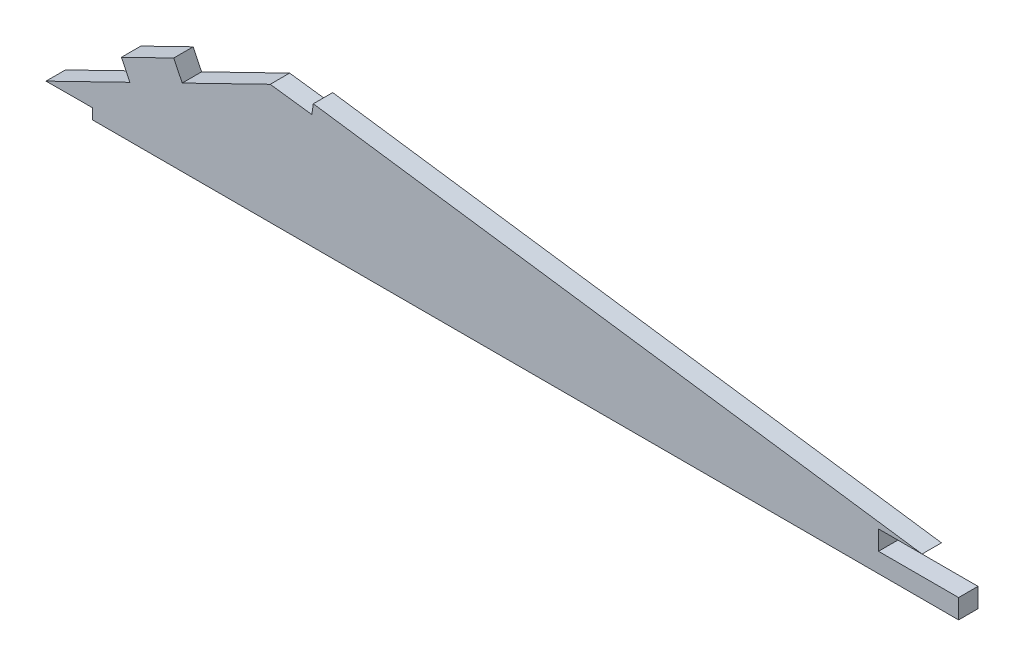
ISO-10303-21;
HEADER;
FILE_DESCRIPTION(('STEP AP214'),'2;1');
FILE_NAME('part.step','',(''),(''),'','','');
FILE_SCHEMA(('AUTOMOTIVE_DESIGN { 1 0 10303 214 1 1 1 1 }'));
ENDSEC;
DATA;
#1=APPLICATION_CONTEXT('core data for automotive mechanical design processes');
#2=APPLICATION_PROTOCOL_DEFINITION('international standard','automotive_design',2000,#1);
#3=PRODUCT_CONTEXT('',#1,'mechanical');
#4=PRODUCT('Part','Part','',(#3));
#5=PRODUCT_RELATED_PRODUCT_CATEGORY('part','',(#4));
#6=PRODUCT_DEFINITION_FORMATION('','',#4);
#7=PRODUCT_DEFINITION_CONTEXT('part definition',#1,'design');
#8=PRODUCT_DEFINITION('design','',#6,#7);
#9=PRODUCT_DEFINITION_SHAPE('','',#8);
#10=(LENGTH_UNIT() NAMED_UNIT(*) SI_UNIT(.MILLI.,.METRE.));
#11=(NAMED_UNIT(*) PLANE_ANGLE_UNIT() SI_UNIT($,.RADIAN.));
#12=(NAMED_UNIT(*) SI_UNIT($,.STERADIAN.) SOLID_ANGLE_UNIT());
#13=UNCERTAINTY_MEASURE_WITH_UNIT(LENGTH_MEASURE(1.E-05),#10,'distance_accuracy_value','');
#14=(GEOMETRIC_REPRESENTATION_CONTEXT(3) GLOBAL_UNCERTAINTY_ASSIGNED_CONTEXT((#13)) GLOBAL_UNIT_ASSIGNED_CONTEXT((#10,
#11,#12)) REPRESENTATION_CONTEXT('',''));
#15=CARTESIAN_POINT('',(0.,0.,0.));
#16=DIRECTION('',(0.,0.,1.));
#17=DIRECTION('',(1.,0.,0.));
#18=AXIS2_PLACEMENT_3D('',#15,#16,#17);
#19=CARTESIAN_POINT('',(10.8739383878739,9.30096898102377,2.));
#20=DIRECTION('',(0.438371146789072,-0.89879404629917,0.));
#21=DIRECTION('',(0.89879404629917,0.438371146789072,0.));
#22=AXIS2_PLACEMENT_3D('',#19,#20,#21);
#23=PLANE('',#22);
#24=DIRECTION('',(-0.898794046299169,-0.438371146789072,0.));
#25=VECTOR('',#24,1.);
#26=CARTESIAN_POINT('',(10.8739383878739,9.30096898102377,0.));
#27=LINE('',#26,#25);
#28=CARTESIAN_POINT('',(10.8739383878739,9.30096898102377,0.));
#29=VERTEX_POINT('',#28);
#30=CARTESIAN_POINT('',(2.2239444862891,5.08208506432496,0.));
#31=VERTEX_POINT('',#30);
#32=EDGE_CURVE('E182',#29,#31,#27,.T.);
#33=ORIENTED_EDGE('',*,*,#32,.T.);
#34=DIRECTION('',(0.,0.,-1.));
#35=VECTOR('',#34,1.);
#36=CARTESIAN_POINT('',(2.2239444862891,5.08208506432496,2.));
#37=LINE('',#36,#35);
#38=CARTESIAN_POINT('',(2.2239444862891,5.08208506432496,2.));
#39=VERTEX_POINT('',#38);
#40=EDGE_CURVE('E11',#39,#31,#37,.T.);
#41=ORIENTED_EDGE('',*,*,#40,.F.);
#42=DIRECTION('',(-0.898794046299169,-0.438371146789072,0.));
#43=VECTOR('',#42,1.);
#44=CARTESIAN_POINT('',(10.8739383878739,9.30096898102377,2.));
#45=LINE('',#44,#43);
#46=CARTESIAN_POINT('',(10.8739383878739,9.30096898102377,2.));
#47=VERTEX_POINT('',#46);
#48=EDGE_CURVE('E225',#47,#39,#45,.T.);
#49=ORIENTED_EDGE('',*,*,#48,.F.);
#50=DIRECTION('',(0.,0.,-1.));
#51=VECTOR('',#50,1.);
#52=CARTESIAN_POINT('',(10.8739383878739,9.30096898102377,2.));
#53=LINE('',#52,#51);
#54=EDGE_CURVE('E178',#47,#29,#53,.T.);
#55=ORIENTED_EDGE('',*,*,#54,.T.);
#56=EDGE_LOOP('',(#33,#41,#49,#55));
#57=FACE_BOUND('',#56,.T.);
#58=ADVANCED_FACE('F39',(#57),#23,.F.);
#59=CARTESIAN_POINT('',(7.00541028453807,5.10064133549443,2.));
#60=DIRECTION('',(-0.00388084579378902,0.999992469489608,0.));
#61=DIRECTION('',(-0.999992469489608,-0.00388084579378902,0.));
#62=AXIS2_PLACEMENT_3D('',#59,#60,#61);
#63=PLANE('',#62);
#64=DIRECTION('',(0.999992469489608,0.00388084579378902,0.));
#65=VECTOR('',#64,1.);
#66=CARTESIAN_POINT('',(7.00541028453807,5.10064133549443,0.));
#67=LINE('',#66,#65);
#68=CARTESIAN_POINT('',(7.00541028453807,5.10064133549443,0.));
#69=VERTEX_POINT('',#68);
#70=EDGE_CURVE('E186',#31,#69,#67,.T.);
#71=ORIENTED_EDGE('',*,*,#70,.T.);
#72=DIRECTION('',(0.,0.,-1.));
#73=VECTOR('',#72,1.);
#74=CARTESIAN_POINT('',(7.00541028453807,5.10064133549443,2.));
#75=LINE('',#74,#73);
#76=CARTESIAN_POINT('',(7.00541028453807,5.10064133549443,2.));
#77=VERTEX_POINT('',#76);
#78=EDGE_CURVE('E48',#77,#69,#75,.T.);
#79=ORIENTED_EDGE('',*,*,#78,.F.);
#80=DIRECTION('',(0.999992469489608,0.00388084579378902,0.));
#81=VECTOR('',#80,1.);
#82=CARTESIAN_POINT('',(7.00541028453807,5.10064133549443,2.));
#83=LINE('',#82,#81);
#84=EDGE_CURVE('E120',#39,#77,#83,.T.);
#85=ORIENTED_EDGE('',*,*,#84,.F.);
#86=ORIENTED_EDGE('',*,*,#40,.T.);
#87=EDGE_LOOP('',(#71,#79,#85,#86));
#88=FACE_BOUND('',#87,.T.);
#89=ADVANCED_FACE('F340',(#88),#63,.F.);
#90=CARTESIAN_POINT('',(7.00961390900483,4.01747724267128,2.));
#91=DIRECTION('',(0.999992469489616,0.00388084579166572,0.));
#92=DIRECTION('',(-0.00388084579166572,0.999992469489616,0.));
#93=AXIS2_PLACEMENT_3D('',#90,#91,#92);
#94=PLANE('',#93);
#95=DIRECTION('',(0.00388084579166572,-0.999992469489616,0.));
#96=VECTOR('',#95,1.);
#97=CARTESIAN_POINT('',(7.00961390900483,4.01747724267128,0.));
#98=LINE('',#97,#96);
#99=CARTESIAN_POINT('',(7.00961390900483,4.01747724267128,0.));
#100=VERTEX_POINT('',#99);
#101=EDGE_CURVE('E189',#69,#100,#98,.T.);
#102=ORIENTED_EDGE('',*,*,#101,.T.);
#103=DIRECTION('',(0.,0.,-1.));
#104=VECTOR('',#103,1.);
#105=CARTESIAN_POINT('',(7.00961390900483,4.01747724267128,2.));
#106=LINE('',#105,#104);
#107=CARTESIAN_POINT('',(7.00961390900483,4.01747724267128,2.));
#108=VERTEX_POINT('',#107);
#109=EDGE_CURVE('E264',#108,#100,#106,.T.);
#110=ORIENTED_EDGE('',*,*,#109,.F.);
#111=DIRECTION('',(0.00388084579166572,-0.999992469489616,0.));
#112=VECTOR('',#111,1.);
#113=CARTESIAN_POINT('',(7.00961390900483,4.01747724267128,2.));
#114=LINE('',#113,#112);
#115=EDGE_CURVE('E274',#77,#108,#114,.T.);
#116=ORIENTED_EDGE('',*,*,#115,.F.);
#117=ORIENTED_EDGE('',*,*,#78,.T.);
#118=EDGE_LOOP('',(#102,#110,#116,#117));
#119=FACE_BOUND('',#118,.T.);
#120=ADVANCED_FACE('F272',(#119),#94,.F.);
#121=CARTESIAN_POINT('',(7.00961390900483,4.01747724267128,2.));
#122=DIRECTION('',(0.,1.,0.));
#123=DIRECTION('',(0.,0.,1.));
#124=AXIS2_PLACEMENT_3D('',#121,#122,#123);
#125=PLANE('',#124);
#126=DIRECTION('',(1.,0.,0.));
#127=VECTOR('',#126,1.);
#128=CARTESIAN_POINT('',(7.00961390900483,4.01747724267128,0.));
#129=LINE('',#128,#127);
#130=CARTESIAN_POINT('',(96.2983160361384,4.01747724267128,0.));
#131=VERTEX_POINT('',#130);
#132=EDGE_CURVE('E192',#100,#131,#129,.T.);
#133=ORIENTED_EDGE('',*,*,#132,.T.);
#134=DIRECTION('',(0.,0.,-1.));
#135=VECTOR('',#134,1.);
#136=CARTESIAN_POINT('',(96.2983160361384,4.01747724267128,2.));
#137=LINE('',#136,#135);
#138=CARTESIAN_POINT('',(96.2983160361384,4.01747724267128,2.));
#139=VERTEX_POINT('',#138);
#140=EDGE_CURVE('E260',#139,#131,#137,.T.);
#141=ORIENTED_EDGE('',*,*,#140,.F.);
#142=DIRECTION('',(1.,0.,0.));
#143=VECTOR('',#142,1.);
#144=CARTESIAN_POINT('',(7.00961390900483,4.01747724267128,2.));
#145=LINE('',#144,#143);
#146=EDGE_CURVE('E293',#108,#139,#145,.T.);
#147=ORIENTED_EDGE('',*,*,#146,.F.);
#148=ORIENTED_EDGE('',*,*,#109,.T.);
#149=EDGE_LOOP('',(#133,#141,#147,#148));
#150=FACE_BOUND('',#149,.T.);
#151=ADVANCED_FACE('F283',(#150),#125,.F.);
#152=CARTESIAN_POINT('',(96.2983160361384,4.01747724267128,2.));
#153=DIRECTION('',(-1.,0.,0.));
#154=DIRECTION('',(0.,0.,1.));
#155=AXIS2_PLACEMENT_3D('',#152,#153,#154);
#156=PLANE('',#155);
#157=DIRECTION('',(0.,1.,0.));
#158=VECTOR('',#157,1.);
#159=CARTESIAN_POINT('',(96.2983160361384,4.01747724267128,0.));
#160=LINE('',#159,#158);
#161=CARTESIAN_POINT('',(96.2983160361384,6.01747724267128,0.));
#162=VERTEX_POINT('',#161);
#163=EDGE_CURVE('E195',#131,#162,#160,.T.);
#164=ORIENTED_EDGE('',*,*,#163,.T.);
#165=DIRECTION('',(0.,0.,-1.));
#166=VECTOR('',#165,1.);
#167=CARTESIAN_POINT('',(96.2983160361384,6.01747724267128,2.));
#168=LINE('',#167,#166);
#169=CARTESIAN_POINT('',(96.2983160361384,6.01747724267128,2.));
#170=VERTEX_POINT('',#169);
#171=EDGE_CURVE('E256',#170,#162,#168,.T.);
#172=ORIENTED_EDGE('',*,*,#171,.F.);
#173=DIRECTION('',(0.,1.,0.));
#174=VECTOR('',#173,1.);
#175=CARTESIAN_POINT('',(96.2983160361384,4.01747724267128,2.));
#176=LINE('',#175,#174);
#177=EDGE_CURVE('E289',#139,#170,#176,.T.);
#178=ORIENTED_EDGE('',*,*,#177,.F.);
#179=ORIENTED_EDGE('',*,*,#140,.T.);
#180=EDGE_LOOP('',(#164,#172,#178,#179));
#181=FACE_BOUND('',#180,.T.);
#182=ADVANCED_FACE('F287',(#181),#156,.F.);
#183=CARTESIAN_POINT('',(88.0421396401572,6.01747724267128,2.));
#184=DIRECTION('',(0.,-1.,0.));
#185=DIRECTION('',(0.,0.,-1.));
#186=AXIS2_PLACEMENT_3D('',#183,#184,#185);
#187=PLANE('',#186);
#188=DIRECTION('',(-1.,0.,0.));
#189=VECTOR('',#188,1.);
#190=CARTESIAN_POINT('',(88.0421396401572,6.01747724267128,0.));
#191=LINE('',#190,#189);
#192=CARTESIAN_POINT('',(88.0421396401572,6.01747724267128,0.));
#193=VERTEX_POINT('',#192);
#194=EDGE_CURVE('E198',#162,#193,#191,.T.);
#195=ORIENTED_EDGE('',*,*,#194,.T.);
#196=DIRECTION('',(0.,0.,-1.));
#197=VECTOR('',#196,1.);
#198=CARTESIAN_POINT('',(88.0421396401572,6.01747724267128,2.));
#199=LINE('',#198,#197);
#200=CARTESIAN_POINT('',(88.0421396401572,6.01747724267128,2.));
#201=VERTEX_POINT('',#200);
#202=EDGE_CURVE('E252',#201,#193,#199,.T.);
#203=ORIENTED_EDGE('',*,*,#202,.F.);
#204=DIRECTION('',(-1.,0.,0.));
#205=VECTOR('',#204,1.);
#206=CARTESIAN_POINT('',(88.0421396401572,6.01747724267128,2.));
#207=LINE('',#206,#205);
#208=EDGE_CURVE('E292',#170,#201,#207,.T.);
#209=ORIENTED_EDGE('',*,*,#208,.F.);
#210=ORIENTED_EDGE('',*,*,#171,.T.);
#211=EDGE_LOOP('',(#195,#203,#209,#210));
#212=FACE_BOUND('',#211,.T.);
#213=ADVANCED_FACE('F353',(#212),#187,.F.);
#214=CARTESIAN_POINT('',(88.0421396401572,6.01747724267128,2.));
#215=DIRECTION('',(-1.,-4.57966997657877E-13,0.));
#216=DIRECTION('',(4.57966997657877E-13,-1.,0.));
#217=AXIS2_PLACEMENT_3D('',#214,#215,#216);
#218=PLANE('',#217);
#219=DIRECTION('',(-4.57966997657877E-13,1.,0.));
#220=VECTOR('',#219,1.);
#221=CARTESIAN_POINT('',(88.0421396401572,6.01747724267128,0.));
#222=LINE('',#221,#220);
#223=CARTESIAN_POINT('',(88.0421396401563,8.01747724267128,0.));
#224=VERTEX_POINT('',#223);
#225=EDGE_CURVE('E201',#193,#224,#222,.T.);
#226=ORIENTED_EDGE('',*,*,#225,.T.);
#227=DIRECTION('',(0.,0.,-1.));
#228=VECTOR('',#227,1.);
#229=CARTESIAN_POINT('',(88.0421396401563,8.01747724267128,2.));
#230=LINE('',#229,#228);
#231=CARTESIAN_POINT('',(88.0421396401563,8.01747724267128,2.));
#232=VERTEX_POINT('',#231);
#233=EDGE_CURVE('E248',#232,#224,#230,.T.);
#234=ORIENTED_EDGE('',*,*,#233,.F.);
#235=DIRECTION('',(-4.57966997657877E-13,1.,0.));
#236=VECTOR('',#235,1.);
#237=CARTESIAN_POINT('',(88.0421396401572,6.01747724267128,2.));
#238=LINE('',#237,#236);
#239=EDGE_CURVE('E297',#201,#232,#238,.T.);
#240=ORIENTED_EDGE('',*,*,#239,.F.);
#241=ORIENTED_EDGE('',*,*,#202,.T.);
#242=EDGE_LOOP('',(#226,#234,#240,#241));
#243=FACE_BOUND('',#242,.T.);
#244=ADVANCED_FACE('F356',(#243),#218,.F.);
#245=CARTESIAN_POINT('',(88.0421396401563,8.01747724267128,2.));
#246=DIRECTION('',(0.,1.,0.));
#247=DIRECTION('',(0.,0.,1.));
#248=AXIS2_PLACEMENT_3D('',#245,#246,#247);
#249=PLANE('',#248);
#250=DIRECTION('',(1.,0.,0.));
#251=VECTOR('',#250,1.);
#252=CARTESIAN_POINT('',(88.0421396401563,8.01747724267128,0.));
#253=LINE('',#252,#251);
#254=CARTESIAN_POINT('',(92.5317577549287,8.01747724267128,0.));
#255=VERTEX_POINT('',#254);
#256=EDGE_CURVE('E204',#224,#255,#253,.T.);
#257=ORIENTED_EDGE('',*,*,#256,.T.);
#258=DIRECTION('',(0.,0.,-1.));
#259=VECTOR('',#258,1.);
#260=CARTESIAN_POINT('',(92.5317577549287,8.01747724267128,2.));
#261=LINE('',#260,#259);
#262=CARTESIAN_POINT('',(92.5317577549287,8.01747724267128,2.));
#263=VERTEX_POINT('',#262);
#264=EDGE_CURVE('E244',#263,#255,#261,.T.);
#265=ORIENTED_EDGE('',*,*,#264,.F.);
#266=DIRECTION('',(1.,0.,0.));
#267=VECTOR('',#266,1.);
#268=CARTESIAN_POINT('',(88.0421396401563,8.01747724267128,2.));
#269=LINE('',#268,#267);
#270=EDGE_CURVE('E304',#232,#263,#269,.T.);
#271=ORIENTED_EDGE('',*,*,#270,.F.);
#272=ORIENTED_EDGE('',*,*,#233,.T.);
#273=EDGE_LOOP('',(#257,#265,#271,#272));
#274=FACE_BOUND('',#273,.T.);
#275=ADVANCED_FACE('F360',(#274),#249,.F.);
#276=CARTESIAN_POINT('',(29.7785199666234,16.8368696617186,2.));
#277=DIRECTION('',(-0.139173100960084,-0.990268068741568,0.));
#278=DIRECTION('',(0.990268068741568,-0.139173100960084,0.));
#279=AXIS2_PLACEMENT_3D('',#276,#277,#278);
#280=PLANE('',#279);
#281=DIRECTION('',(-0.990268068741568,0.139173100960084,0.));
#282=VECTOR('',#281,1.);
#283=CARTESIAN_POINT('',(29.7785199666234,16.8368696617186,0.));
#284=LINE('',#283,#282);
#285=CARTESIAN_POINT('',(29.7785199666234,16.8368696617186,0.));
#286=VERTEX_POINT('',#285);
#287=EDGE_CURVE('E207',#255,#286,#284,.T.);
#288=ORIENTED_EDGE('',*,*,#287,.T.);
#289=DIRECTION('',(0.,0.,-1.));
#290=VECTOR('',#289,1.);
#291=CARTESIAN_POINT('',(29.7785199666234,16.8368696617186,2.));
#292=LINE('',#291,#290);
#293=CARTESIAN_POINT('',(29.7785199666234,16.8368696617186,2.));
#294=VERTEX_POINT('',#293);
#295=EDGE_CURVE('E240',#294,#286,#292,.T.);
#296=ORIENTED_EDGE('',*,*,#295,.F.);
#297=DIRECTION('',(-0.990268068741568,0.139173100960084,0.));
#298=VECTOR('',#297,1.);
#299=CARTESIAN_POINT('',(29.7785199666234,16.8368696617186,2.));
#300=LINE('',#299,#298);
#301=EDGE_CURVE('E307',#263,#294,#300,.T.);
#302=ORIENTED_EDGE('',*,*,#301,.F.);
#303=ORIENTED_EDGE('',*,*,#264,.T.);
#304=EDGE_LOOP('',(#288,#296,#302,#303));
#305=FACE_BOUND('',#304,.T.);
#306=ADVANCED_FACE('F364',(#305),#280,.F.);
#307=CARTESIAN_POINT('',(29.6303099138324,15.7991774042635,2.));
#308=DIRECTION('',(0.989953726819019,-0.141391720963904,0.));
#309=DIRECTION('',(0.141391720963904,0.989953726819019,0.));
#310=AXIS2_PLACEMENT_3D('',#307,#308,#309);
#311=PLANE('',#310);
#312=DIRECTION('',(-0.141391720963904,-0.989953726819019,0.));
#313=VECTOR('',#312,1.);
#314=CARTESIAN_POINT('',(29.6303099138324,15.7991774042635,0.));
#315=LINE('',#314,#313);
#316=CARTESIAN_POINT('',(29.6303099138324,15.7991774042635,0.));
#317=VERTEX_POINT('',#316);
#318=EDGE_CURVE('E210',#286,#317,#315,.T.);
#319=ORIENTED_EDGE('',*,*,#318,.T.);
#320=DIRECTION('',(0.,0.,-1.));
#321=VECTOR('',#320,1.);
#322=CARTESIAN_POINT('',(29.6303099138324,15.7991774042635,2.));
#323=LINE('',#322,#321);
#324=CARTESIAN_POINT('',(29.6303099138324,15.7991774042635,2.));
#325=VERTEX_POINT('',#324);
#326=EDGE_CURVE('E236',#325,#317,#323,.T.);
#327=ORIENTED_EDGE('',*,*,#326,.F.);
#328=DIRECTION('',(-0.141391720963904,-0.989953726819019,0.));
#329=VECTOR('',#328,1.);
#330=CARTESIAN_POINT('',(29.6303099138324,15.7991774042635,2.));
#331=LINE('',#330,#329);
#332=EDGE_CURVE('E310',#294,#325,#331,.T.);
#333=ORIENTED_EDGE('',*,*,#332,.F.);
#334=ORIENTED_EDGE('',*,*,#295,.T.);
#335=EDGE_LOOP('',(#319,#327,#333,#334));
#336=FACE_BOUND('',#335,.T.);
#337=ADVANCED_FACE('F368',(#336),#311,.F.);
#338=CARTESIAN_POINT('',(25.3360842904614,16.35462883831,2.));
#339=DIRECTION('',(-0.128279776916056,-0.991738019254262,0.));
#340=DIRECTION('',(0.991738019254262,-0.128279776916056,0.));
#341=AXIS2_PLACEMENT_3D('',#338,#339,#340);
#342=PLANE('',#341);
#343=DIRECTION('',(-0.991738019254262,0.128279776916056,0.));
#344=VECTOR('',#343,1.);
#345=CARTESIAN_POINT('',(25.3360842904614,16.35462883831,0.));
#346=LINE('',#345,#344);
#347=CARTESIAN_POINT('',(25.3360842904614,16.35462883831,0.));
#348=VERTEX_POINT('',#347);
#349=EDGE_CURVE('E213',#317,#348,#346,.T.);
#350=ORIENTED_EDGE('',*,*,#349,.T.);
#351=DIRECTION('',(0.,0.,-1.));
#352=VECTOR('',#351,1.);
#353=CARTESIAN_POINT('',(25.3360842904614,16.35462883831,2.));
#354=LINE('',#353,#352);
#355=CARTESIAN_POINT('',(25.3360842904614,16.35462883831,2.));
#356=VERTEX_POINT('',#355);
#357=EDGE_CURVE('E232',#356,#348,#354,.T.);
#358=ORIENTED_EDGE('',*,*,#357,.F.);
#359=DIRECTION('',(-0.991738019254262,0.128279776916056,0.));
#360=VECTOR('',#359,1.);
#361=CARTESIAN_POINT('',(25.3360842904614,16.35462883831,2.));
#362=LINE('',#361,#360);
#363=EDGE_CURVE('E313',#325,#356,#362,.T.);
#364=ORIENTED_EDGE('',*,*,#363,.F.);
#365=ORIENTED_EDGE('',*,*,#326,.T.);
#366=EDGE_LOOP('',(#350,#358,#364,#365));
#367=FACE_BOUND('',#366,.T.);
#368=ADVANCED_FACE('F321',(#367),#342,.F.);
#369=CARTESIAN_POINT('',(16.2667026656683,11.9311958617582,2.));
#370=DIRECTION('',(0.438371146789061,-0.898794046299175,0.));
#371=DIRECTION('',(0.898794046299175,0.438371146789061,0.));
#372=AXIS2_PLACEMENT_3D('',#369,#370,#371);
#373=PLANE('',#372);
#374=DIRECTION('',(-0.898794046299175,-0.438371146789061,0.));
#375=VECTOR('',#374,1.);
#376=CARTESIAN_POINT('',(16.2667026656683,11.9311958617582,0.));
#377=LINE('',#376,#375);
#378=CARTESIAN_POINT('',(16.2667026656683,11.9311958617582,0.));
#379=VERTEX_POINT('',#378);
#380=EDGE_CURVE('E216',#348,#379,#377,.T.);
#381=ORIENTED_EDGE('',*,*,#380,.T.);
#382=DIRECTION('',(0.,0.,-1.));
#383=VECTOR('',#382,1.);
#384=CARTESIAN_POINT('',(16.2667026656683,11.9311958617582,2.));
#385=LINE('',#384,#383);
#386=CARTESIAN_POINT('',(16.2667026656683,11.9311958617582,2.));
#387=VERTEX_POINT('',#386);
#388=EDGE_CURVE('E171',#387,#379,#385,.T.);
#389=ORIENTED_EDGE('',*,*,#388,.F.);
#390=DIRECTION('',(-0.898794046299175,-0.438371146789061,0.));
#391=VECTOR('',#390,1.);
#392=CARTESIAN_POINT('',(16.2667026656683,11.9311958617582,2.));
#393=LINE('',#392,#391);
#394=EDGE_CURVE('E160',#356,#387,#393,.T.);
#395=ORIENTED_EDGE('',*,*,#394,.F.);
#396=ORIENTED_EDGE('',*,*,#357,.T.);
#397=EDGE_LOOP('',(#381,#389,#395,#396));
#398=FACE_BOUND('',#397,.T.);
#399=ADVANCED_FACE('F325',(#398),#373,.F.);
#400=CARTESIAN_POINT('',(15.3899603720903,13.7287839543565,2.));
#401=DIRECTION('',(-0.898794046299195,-0.43837114678902,0.));
#402=DIRECTION('',(0.43837114678902,-0.898794046299195,0.));
#403=AXIS2_PLACEMENT_3D('',#400,#401,#402);
#404=PLANE('',#403);
#405=DIRECTION('',(-0.43837114678902,0.898794046299195,0.));
#406=VECTOR('',#405,1.);
#407=CARTESIAN_POINT('',(15.3899603720903,13.7287839543565,0.));
#408=LINE('',#407,#406);
#409=CARTESIAN_POINT('',(15.3899603720903,13.7287839543565,0.));
#410=VERTEX_POINT('',#409);
#411=EDGE_CURVE('E169',#379,#410,#408,.T.);
#412=ORIENTED_EDGE('',*,*,#411,.T.);
#413=DIRECTION('',(0.,0.,-1.));
#414=VECTOR('',#413,1.);
#415=CARTESIAN_POINT('',(15.3899603720903,13.7287839543565,2.));
#416=LINE('',#415,#414);
#417=CARTESIAN_POINT('',(15.3899603720903,13.7287839543565,2.));
#418=VERTEX_POINT('',#417);
#419=EDGE_CURVE('E166',#418,#410,#416,.T.);
#420=ORIENTED_EDGE('',*,*,#419,.F.);
#421=DIRECTION('',(-0.43837114678902,0.898794046299195,0.));
#422=VECTOR('',#421,1.);
#423=CARTESIAN_POINT('',(15.3899603720903,13.7287839543565,2.));
#424=LINE('',#423,#422);
#425=EDGE_CURVE('E154',#387,#418,#424,.T.);
#426=ORIENTED_EDGE('',*,*,#425,.F.);
#427=ORIENTED_EDGE('',*,*,#388,.T.);
#428=EDGE_LOOP('',(#412,#420,#426,#427));
#429=FACE_BOUND('',#428,.T.);
#430=ADVANCED_FACE('F167',(#429),#404,.F.);
#431=CARTESIAN_POINT('',(9.99719609429593,11.0985570736225,2.));
#432=DIRECTION('',(0.43837114678905,-0.89879404629918,0.));
#433=DIRECTION('',(0.89879404629918,0.43837114678905,0.));
#434=AXIS2_PLACEMENT_3D('',#431,#432,#433);
#435=PLANE('',#434);
#436=DIRECTION('',(-0.89879404629918,-0.43837114678905,0.));
#437=VECTOR('',#436,1.);
#438=CARTESIAN_POINT('',(9.99719609429593,11.0985570736225,0.));
#439=LINE('',#438,#437);
#440=CARTESIAN_POINT('',(9.99719609429593,11.0985570736225,0.));
#441=VERTEX_POINT('',#440);
#442=EDGE_CURVE('E106',#410,#441,#439,.T.);
#443=ORIENTED_EDGE('',*,*,#442,.T.);
#444=DIRECTION('',(0.,0.,-1.));
#445=VECTOR('',#444,1.);
#446=CARTESIAN_POINT('',(9.99719609429593,11.0985570736225,2.));
#447=LINE('',#446,#445);
#448=CARTESIAN_POINT('',(9.99719609429593,11.0985570736225,2.));
#449=VERTEX_POINT('',#448);
#450=EDGE_CURVE('E172',#449,#441,#447,.T.);
#451=ORIENTED_EDGE('',*,*,#450,.F.);
#452=DIRECTION('',(-0.89879404629918,-0.43837114678905,0.));
#453=VECTOR('',#452,1.);
#454=CARTESIAN_POINT('',(9.99719609429593,11.0985570736225,2.));
#455=LINE('',#454,#453);
#456=EDGE_CURVE('E158',#418,#449,#455,.T.);
#457=ORIENTED_EDGE('',*,*,#456,.F.);
#458=ORIENTED_EDGE('',*,*,#419,.T.);
#459=EDGE_LOOP('',(#443,#451,#457,#458));
#460=FACE_BOUND('',#459,.T.);
#461=ADVANCED_FACE('F174',(#460),#435,.F.);
#462=CARTESIAN_POINT('',(10.8739383878739,9.30096898102377,2.));
#463=DIRECTION('',(0.898794046299239,0.43837114678893,0.));
#464=DIRECTION('',(-0.43837114678893,0.898794046299239,0.));
#465=AXIS2_PLACEMENT_3D('',#462,#463,#464);
#466=PLANE('',#465);
#467=DIRECTION('',(0.43837114678893,-0.898794046299239,0.));
#468=VECTOR('',#467,1.);
#469=CARTESIAN_POINT('',(10.8739383878739,9.30096898102377,0.));
#470=LINE('',#469,#468);
#471=EDGE_CURVE('E112',#441,#29,#470,.T.);
#472=ORIENTED_EDGE('',*,*,#471,.T.);
#473=ORIENTED_EDGE('',*,*,#54,.F.);
#474=DIRECTION('',(0.43837114678893,-0.898794046299239,0.));
#475=VECTOR('',#474,1.);
#476=CARTESIAN_POINT('',(10.8739383878739,9.30096898102377,2.));
#477=LINE('',#476,#475);
#478=EDGE_CURVE('E56',#449,#47,#477,.T.);
#479=ORIENTED_EDGE('',*,*,#478,.F.);
#480=ORIENTED_EDGE('',*,*,#450,.T.);
#481=EDGE_LOOP('',(#472,#473,#479,#480));
#482=FACE_BOUND('',#481,.T.);
#483=ADVANCED_FACE('F329',(#482),#466,.F.);
#484=CARTESIAN_POINT('',(0.,0.,2.));
#485=DIRECTION('',(0.,0.,1.));
#486=DIRECTION('',(1.,0.,0.));
#487=AXIS2_PLACEMENT_3D('',#484,#485,#486);
#488=PLANE('',#487);
#489=ORIENTED_EDGE('',*,*,#48,.T.);
#490=ORIENTED_EDGE('',*,*,#84,.T.);
#491=ORIENTED_EDGE('',*,*,#115,.T.);
#492=ORIENTED_EDGE('',*,*,#146,.T.);
#493=ORIENTED_EDGE('',*,*,#177,.T.);
#494=ORIENTED_EDGE('',*,*,#208,.T.);
#495=ORIENTED_EDGE('',*,*,#239,.T.);
#496=ORIENTED_EDGE('',*,*,#270,.T.);
#497=ORIENTED_EDGE('',*,*,#301,.T.);
#498=ORIENTED_EDGE('',*,*,#332,.T.);
#499=ORIENTED_EDGE('',*,*,#363,.T.);
#500=ORIENTED_EDGE('',*,*,#394,.T.);
#501=ORIENTED_EDGE('',*,*,#425,.T.);
#502=ORIENTED_EDGE('',*,*,#456,.T.);
#503=ORIENTED_EDGE('',*,*,#478,.T.);
#504=EDGE_LOOP('',(#489,#490,#491,#492,#493,#494,#495,#496,#497,#498,#499,#500,#501,#502,#503));
#505=FACE_BOUND('',#504,.T.);
#506=ADVANCED_FACE('F156',(#505),#488,.T.);
#507=CARTESIAN_POINT('',(0.,0.,0.));
#508=DIRECTION('',(0.,0.,1.));
#509=DIRECTION('',(1.,0.,0.));
#510=AXIS2_PLACEMENT_3D('',#507,#508,#509);
#511=PLANE('',#510);
#512=ORIENTED_EDGE('',*,*,#32,.F.);
#513=ORIENTED_EDGE('',*,*,#471,.F.);
#514=ORIENTED_EDGE('',*,*,#442,.F.);
#515=ORIENTED_EDGE('',*,*,#411,.F.);
#516=ORIENTED_EDGE('',*,*,#380,.F.);
#517=ORIENTED_EDGE('',*,*,#349,.F.);
#518=ORIENTED_EDGE('',*,*,#318,.F.);
#519=ORIENTED_EDGE('',*,*,#287,.F.);
#520=ORIENTED_EDGE('',*,*,#256,.F.);
#521=ORIENTED_EDGE('',*,*,#225,.F.);
#522=ORIENTED_EDGE('',*,*,#194,.F.);
#523=ORIENTED_EDGE('',*,*,#163,.F.);
#524=ORIENTED_EDGE('',*,*,#132,.F.);
#525=ORIENTED_EDGE('',*,*,#101,.F.);
#526=ORIENTED_EDGE('',*,*,#70,.F.);
#527=EDGE_LOOP('',(#512,#513,#514,#515,#516,#517,#518,#519,#520,#521,#522,#523,#524,#525,#526));
#528=FACE_BOUND('',#527,.T.);
#529=ADVANCED_FACE('F278',(#528),#511,.F.);
#530=CLOSED_SHELL('',(#58,#89,#120,#151,#182,#213,#244,#275,#306,#337,#368,#399,#430,#461,#483,
#506,#529));
#531=MANIFOLD_SOLID_BREP('B2',#530);
#532=ADVANCED_BREP_SHAPE_REPRESENTATION('',(#18,#531),#14);
#533=SHAPE_DEFINITION_REPRESENTATION(#9,#532);
ENDSEC;
END-ISO-10303-21;
